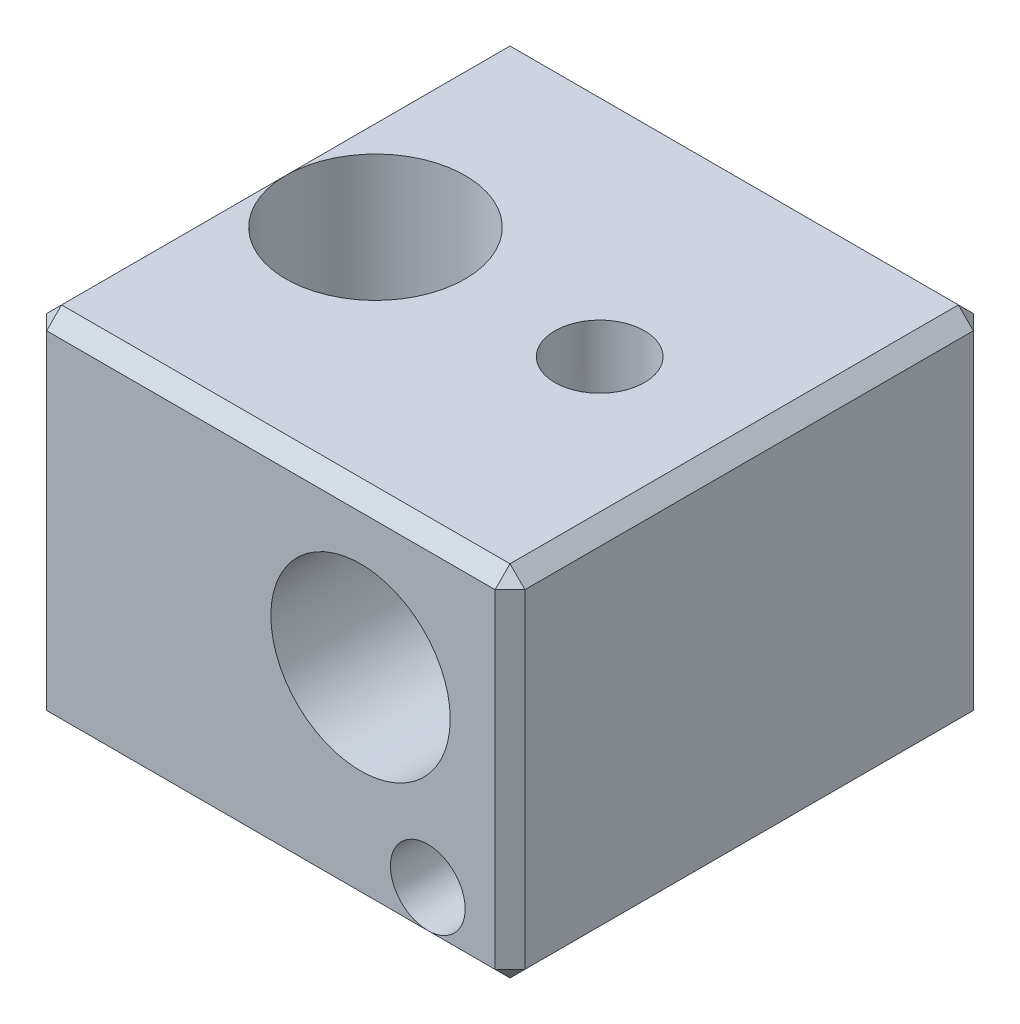
ISO-10303-21;
HEADER;
FILE_DESCRIPTION(('STEP AP214'),'2;1');
FILE_NAME('part.step','',(''),(''),'','','');
FILE_SCHEMA(('AUTOMOTIVE_DESIGN { 1 0 10303 214 1 1 1 1 }'));
ENDSEC;
DATA;
#1=APPLICATION_CONTEXT('core data for automotive mechanical design processes');
#2=APPLICATION_PROTOCOL_DEFINITION('international standard','automotive_design',2000,#1);
#3=PRODUCT_CONTEXT('',#1,'mechanical');
#4=PRODUCT('Part','Part','',(#3));
#5=PRODUCT_RELATED_PRODUCT_CATEGORY('part','',(#4));
#6=PRODUCT_DEFINITION_FORMATION('','',#4);
#7=PRODUCT_DEFINITION_CONTEXT('part definition',#1,'design');
#8=PRODUCT_DEFINITION('design','',#6,#7);
#9=PRODUCT_DEFINITION_SHAPE('','',#8);
#10=(LENGTH_UNIT() NAMED_UNIT(*) SI_UNIT(.MILLI.,.METRE.));
#11=(NAMED_UNIT(*) PLANE_ANGLE_UNIT() SI_UNIT($,.RADIAN.));
#12=(NAMED_UNIT(*) SI_UNIT($,.STERADIAN.) SOLID_ANGLE_UNIT());
#13=UNCERTAINTY_MEASURE_WITH_UNIT(LENGTH_MEASURE(1.E-05),#10,'distance_accuracy_value','');
#14=(GEOMETRIC_REPRESENTATION_CONTEXT(3) GLOBAL_UNCERTAINTY_ASSIGNED_CONTEXT((#13)) GLOBAL_UNIT_ASSIGNED_CONTEXT((#10,
#11,#12)) REPRESENTATION_CONTEXT('',''));
#15=CARTESIAN_POINT('',(0.,0.,0.));
#16=DIRECTION('',(0.,0.,1.));
#17=DIRECTION('',(1.,0.,0.));
#18=AXIS2_PLACEMENT_3D('',#15,#16,#17);
#19=CARTESIAN_POINT('',(-8.,12.,-8.));
#20=DIRECTION('',(1.,0.,0.));
#21=DIRECTION('',(0.,0.,-1.));
#22=AXIS2_PLACEMENT_3D('',#19,#20,#21);
#23=PLANE('',#22);
#24=DIRECTION('',(0.,-1.,0.));
#25=VECTOR('',#24,1.);
#26=CARTESIAN_POINT('',(-8.,12.,-7.5));
#27=LINE('',#26,#25);
#28=CARTESIAN_POINT('',(-8.,11.5,-7.5));
#29=VERTEX_POINT('',#28);
#30=CARTESIAN_POINT('',(-8.,0.5,-7.5));
#31=VERTEX_POINT('',#30);
#32=EDGE_CURVE('E144',#29,#31,#27,.T.);
#33=ORIENTED_EDGE('',*,*,#32,.T.);
#34=DIRECTION('',(0.,0.,1.));
#35=VECTOR('',#34,1.);
#36=CARTESIAN_POINT('',(-8.,0.5,-8.));
#37=LINE('',#36,#35);
#38=CARTESIAN_POINT('',(-8.,0.5,7.5));
#39=VERTEX_POINT('',#38);
#40=EDGE_CURVE('E140',#31,#39,#37,.T.);
#41=ORIENTED_EDGE('',*,*,#40,.T.);
#42=DIRECTION('',(0.,1.,0.));
#43=VECTOR('',#42,1.);
#44=CARTESIAN_POINT('',(-8.,12.,7.5));
#45=LINE('',#44,#43);
#46=CARTESIAN_POINT('',(-8.,11.5,7.5));
#47=VERTEX_POINT('',#46);
#48=EDGE_CURVE('E135',#39,#47,#45,.T.);
#49=ORIENTED_EDGE('',*,*,#48,.T.);
#50=DIRECTION('',(0.,0.,-1.));
#51=VECTOR('',#50,1.);
#52=CARTESIAN_POINT('',(-8.,11.5,-8.));
#53=LINE('',#52,#51);
#54=EDGE_CURVE('E137',#47,#29,#53,.T.);
#55=ORIENTED_EDGE('',*,*,#54,.T.);
#56=EDGE_LOOP('',(#33,#41,#49,#55));
#57=FACE_BOUND('',#56,.T.);
#58=ADVANCED_FACE('F34',(#57),#23,.F.);
#59=CARTESIAN_POINT('',(-8.,12.,8.));
#60=DIRECTION('',(0.,0.,-1.));
#61=DIRECTION('',(-1.,0.,0.));
#62=AXIS2_PLACEMENT_3D('',#59,#60,#61);
#63=PLANE('',#62);
#64=CARTESIAN_POINT('',(3.,7.,8.));
#65=DIRECTION('',(0.,0.,1.));
#66=DIRECTION('',(1.,0.,0.));
#67=AXIS2_PLACEMENT_3D('',#64,#65,#66);
#68=CIRCLE('',#67,3.);
#69=CARTESIAN_POINT('',(6.,7.,8.));
#70=VERTEX_POINT('',#69);
#71=EDGE_CURVE('E214',#70,#70,#68,.T.);
#72=ORIENTED_EDGE('',*,*,#71,.F.);
#73=EDGE_LOOP('',(#72));
#74=FACE_BOUND('',#73,.T.);
#75=DIRECTION('',(0.,-1.,0.));
#76=VECTOR('',#75,1.);
#77=CARTESIAN_POINT('',(-7.49999999999999,12.,8.));
#78=LINE('',#77,#76);
#79=CARTESIAN_POINT('',(-7.49999999999999,11.5,8.));
#80=VERTEX_POINT('',#79);
#81=CARTESIAN_POINT('',(-7.49999999999999,0.500000000000004,8.));
#82=VERTEX_POINT('',#81);
#83=EDGE_CURVE('E167',#80,#82,#78,.T.);
#84=ORIENTED_EDGE('',*,*,#83,.T.);
#85=DIRECTION('',(1.,0.,0.));
#86=VECTOR('',#85,1.);
#87=CARTESIAN_POINT('',(-8.,0.500000000000004,8.));
#88=LINE('',#87,#86);
#89=CARTESIAN_POINT('',(5.25,0.500000000000004,8.));
#90=VERTEX_POINT('',#89);
#91=EDGE_CURVE('E269',#82,#90,#88,.T.);
#92=ORIENTED_EDGE('',*,*,#91,.T.);
#93=CARTESIAN_POINT('',(5.25,1.75,8.));
#94=DIRECTION('',(0.,0.,1.));
#95=DIRECTION('',(1.,0.,0.));
#96=AXIS2_PLACEMENT_3D('',#93,#94,#95);
#97=CIRCLE('',#96,1.25);
#98=EDGE_CURVE('E224',#90,#90,#97,.T.);
#99=ORIENTED_EDGE('',*,*,#98,.F.);
#100=DIRECTION('',(1.,0.,0.));
#101=VECTOR('',#100,1.);
#102=CARTESIAN_POINT('',(-8.,0.500000000000004,8.));
#103=LINE('',#102,#101);
#104=CARTESIAN_POINT('',(7.5,0.500000000000004,8.));
#105=VERTEX_POINT('',#104);
#106=EDGE_CURVE('E267',#90,#105,#103,.T.);
#107=ORIENTED_EDGE('',*,*,#106,.T.);
#108=DIRECTION('',(0.,1.,0.));
#109=VECTOR('',#108,1.);
#110=CARTESIAN_POINT('',(7.5,12.,8.));
#111=LINE('',#110,#109);
#112=CARTESIAN_POINT('',(7.5,11.5,8.));
#113=VERTEX_POINT('',#112);
#114=EDGE_CURVE('E265',#105,#113,#111,.T.);
#115=ORIENTED_EDGE('',*,*,#114,.T.);
#116=DIRECTION('',(-1.,0.,0.));
#117=VECTOR('',#116,1.);
#118=CARTESIAN_POINT('',(-8.,11.5,8.));
#119=LINE('',#118,#117);
#120=EDGE_CURVE('E262',#113,#80,#119,.T.);
#121=ORIENTED_EDGE('',*,*,#120,.T.);
#122=EDGE_LOOP('',(#84,#92,#99,#107,#115,#121));
#123=FACE_BOUND('',#122,.T.);
#124=ADVANCED_FACE('F323',(#74,#123),#63,.F.);
#125=CARTESIAN_POINT('',(8.,12.,-8.));
#126=DIRECTION('',(-1.,0.,0.));
#127=DIRECTION('',(0.,0.,1.));
#128=AXIS2_PLACEMENT_3D('',#125,#126,#127);
#129=PLANE('',#128);
#130=DIRECTION('',(0.,-1.,0.));
#131=VECTOR('',#130,1.);
#132=CARTESIAN_POINT('',(8.,12.,7.5));
#133=LINE('',#132,#131);
#134=CARTESIAN_POINT('',(8.,11.5,7.5));
#135=VERTEX_POINT('',#134);
#136=CARTESIAN_POINT('',(8.,0.5,7.5));
#137=VERTEX_POINT('',#136);
#138=EDGE_CURVE('E274',#135,#137,#133,.T.);
#139=ORIENTED_EDGE('',*,*,#138,.T.);
#140=DIRECTION('',(0.,0.,-1.));
#141=VECTOR('',#140,1.);
#142=CARTESIAN_POINT('',(8.,0.5,-8.));
#143=LINE('',#142,#141);
#144=CARTESIAN_POINT('',(8.,0.5,-7.5));
#145=VERTEX_POINT('',#144);
#146=EDGE_CURVE('E278',#137,#145,#143,.T.);
#147=ORIENTED_EDGE('',*,*,#146,.T.);
#148=DIRECTION('',(0.,1.,0.));
#149=VECTOR('',#148,1.);
#150=CARTESIAN_POINT('',(8.,12.,-7.5));
#151=LINE('',#150,#149);
#152=CARTESIAN_POINT('',(8.,11.5,-7.5));
#153=VERTEX_POINT('',#152);
#154=EDGE_CURVE('E276',#145,#153,#151,.T.);
#155=ORIENTED_EDGE('',*,*,#154,.T.);
#156=DIRECTION('',(0.,0.,1.));
#157=VECTOR('',#156,1.);
#158=CARTESIAN_POINT('',(8.,11.5,8.));
#159=LINE('',#158,#157);
#160=EDGE_CURVE('E272',#153,#135,#159,.T.);
#161=ORIENTED_EDGE('',*,*,#160,.T.);
#162=EDGE_LOOP('',(#139,#147,#155,#161));
#163=FACE_BOUND('',#162,.T.);
#164=ADVANCED_FACE('F346',(#163),#129,.F.);
#165=CARTESIAN_POINT('',(-8.,12.,-8.));
#166=DIRECTION('',(0.,0.,1.));
#167=DIRECTION('',(1.,0.,0.));
#168=AXIS2_PLACEMENT_3D('',#165,#166,#167);
#169=PLANE('',#168);
#170=CARTESIAN_POINT('',(3.,7.,-8.));
#171=DIRECTION('',(0.,0.,1.));
#172=DIRECTION('',(1.,0.,0.));
#173=AXIS2_PLACEMENT_3D('',#170,#171,#172);
#174=CIRCLE('',#173,3.);
#175=CARTESIAN_POINT('',(6.,7.,-8.));
#176=VERTEX_POINT('',#175);
#177=EDGE_CURVE('E219',#176,#176,#174,.T.);
#178=ORIENTED_EDGE('',*,*,#177,.T.);
#179=EDGE_LOOP('',(#178));
#180=FACE_BOUND('',#179,.T.);
#181=DIRECTION('',(0.,-1.,0.));
#182=VECTOR('',#181,1.);
#183=CARTESIAN_POINT('',(7.5,12.,-8.));
#184=LINE('',#183,#182);
#185=CARTESIAN_POINT('',(7.5,11.5,-8.));
#186=VERTEX_POINT('',#185);
#187=CARTESIAN_POINT('',(7.5,0.5,-8.));
#188=VERTEX_POINT('',#187);
#189=EDGE_CURVE('E255',#186,#188,#184,.T.);
#190=ORIENTED_EDGE('',*,*,#189,.T.);
#191=DIRECTION('',(-1.,0.,0.));
#192=VECTOR('',#191,1.);
#193=CARTESIAN_POINT('',(-8.,0.5,-8.));
#194=LINE('',#193,#192);
#195=CARTESIAN_POINT('',(5.25,0.5,-8.));
#196=VERTEX_POINT('',#195);
#197=EDGE_CURVE('E259',#188,#196,#194,.T.);
#198=ORIENTED_EDGE('',*,*,#197,.T.);
#199=CARTESIAN_POINT('',(5.25,1.75,-8.));
#200=DIRECTION('',(0.,0.,1.));
#201=DIRECTION('',(1.,0.,0.));
#202=AXIS2_PLACEMENT_3D('',#199,#200,#201);
#203=CIRCLE('',#202,1.25);
#204=EDGE_CURVE('E228',#196,#196,#203,.T.);
#205=ORIENTED_EDGE('',*,*,#204,.T.);
#206=DIRECTION('',(-1.,0.,0.));
#207=VECTOR('',#206,1.);
#208=CARTESIAN_POINT('',(-8.,0.5,-8.));
#209=LINE('',#208,#207);
#210=CARTESIAN_POINT('',(-7.5,0.5,-8.));
#211=VERTEX_POINT('',#210);
#212=EDGE_CURVE('E257',#196,#211,#209,.T.);
#213=ORIENTED_EDGE('',*,*,#212,.T.);
#214=DIRECTION('',(0.,1.,0.));
#215=VECTOR('',#214,1.);
#216=CARTESIAN_POINT('',(-7.5,12.,-8.));
#217=LINE('',#216,#215);
#218=CARTESIAN_POINT('',(-7.5,11.5,-8.));
#219=VERTEX_POINT('',#218);
#220=EDGE_CURVE('E253',#211,#219,#217,.T.);
#221=ORIENTED_EDGE('',*,*,#220,.T.);
#222=DIRECTION('',(1.,0.,0.));
#223=VECTOR('',#222,1.);
#224=CARTESIAN_POINT('',(8.,11.5,-8.));
#225=LINE('',#224,#223);
#226=EDGE_CURVE('E251',#219,#186,#225,.T.);
#227=ORIENTED_EDGE('',*,*,#226,.T.);
#228=EDGE_LOOP('',(#190,#198,#205,#213,#221,#227));
#229=FACE_BOUND('',#228,.T.);
#230=ADVANCED_FACE('F433',(#180,#229),#169,.F.);
#231=CARTESIAN_POINT('',(0.,12.,0.));
#232=DIRECTION('',(0.,1.,0.));
#233=DIRECTION('',(0.,0.,1.));
#234=AXIS2_PLACEMENT_3D('',#231,#232,#233);
#235=PLANE('',#234);
#236=CARTESIAN_POINT('',(3.,12.,0.));
#237=DIRECTION('',(0.,1.,0.));
#238=DIRECTION('',(0.,0.,1.));
#239=AXIS2_PLACEMENT_3D('',#236,#237,#238);
#240=CIRCLE('',#239,1.5);
#241=CARTESIAN_POINT('',(3.,12.,1.5));
#242=VERTEX_POINT('',#241);
#243=EDGE_CURVE('E291',#242,#242,#240,.T.);
#244=ORIENTED_EDGE('',*,*,#243,.F.);
#245=EDGE_LOOP('',(#244));
#246=FACE_BOUND('',#245,.T.);
#247=DIRECTION('',(1.,0.,0.));
#248=VECTOR('',#247,1.);
#249=CARTESIAN_POINT('',(8.,12.,7.5));
#250=LINE('',#249,#248);
#251=CARTESIAN_POINT('',(-7.5,12.,7.5));
#252=VERTEX_POINT('',#251);
#253=CARTESIAN_POINT('',(7.5,12.,7.5));
#254=VERTEX_POINT('',#253);
#255=EDGE_CURVE('E281',#252,#254,#250,.T.);
#256=ORIENTED_EDGE('',*,*,#255,.T.);
#257=DIRECTION('',(0.,0.,-1.));
#258=VECTOR('',#257,1.);
#259=CARTESIAN_POINT('',(7.5,12.,-8.));
#260=LINE('',#259,#258);
#261=CARTESIAN_POINT('',(7.5,12.,-7.5));
#262=VERTEX_POINT('',#261);
#263=EDGE_CURVE('E11',#254,#262,#260,.T.);
#264=ORIENTED_EDGE('',*,*,#263,.T.);
#265=DIRECTION('',(-1.,0.,0.));
#266=VECTOR('',#265,1.);
#267=CARTESIAN_POINT('',(-8.,12.,-7.5));
#268=LINE('',#267,#266);
#269=CARTESIAN_POINT('',(-7.5,12.,-7.5));
#270=VERTEX_POINT('',#269);
#271=EDGE_CURVE('E43',#262,#270,#268,.T.);
#272=ORIENTED_EDGE('',*,*,#271,.T.);
#273=DIRECTION('',(0.,0.,1.));
#274=VECTOR('',#273,1.);
#275=CARTESIAN_POINT('',(-7.5,12.,8.));
#276=LINE('',#275,#274);
#277=CARTESIAN_POINT('',(-7.5,12.,0.));
#278=VERTEX_POINT('',#277);
#279=EDGE_CURVE('E285',#270,#278,#276,.T.);
#280=ORIENTED_EDGE('',*,*,#279,.T.);
#281=CARTESIAN_POINT('',(-4.5,12.,0.));
#282=DIRECTION('',(0.,1.,0.));
#283=DIRECTION('',(0.,0.,1.));
#284=AXIS2_PLACEMENT_3D('',#281,#282,#283);
#285=CIRCLE('',#284,3.);
#286=EDGE_CURVE('E231',#278,#278,#285,.T.);
#287=ORIENTED_EDGE('',*,*,#286,.F.);
#288=DIRECTION('',(0.,0.,1.));
#289=VECTOR('',#288,1.);
#290=CARTESIAN_POINT('',(-7.5,12.,8.));
#291=LINE('',#290,#289);
#292=EDGE_CURVE('E283',#278,#252,#291,.T.);
#293=ORIENTED_EDGE('',*,*,#292,.T.);
#294=EDGE_LOOP('',(#256,#264,#272,#280,#287,#293));
#295=FACE_BOUND('',#294,.T.);
#296=ADVANCED_FACE('F416',(#246,#295),#235,.T.);
#297=CARTESIAN_POINT('',(0.,0.,0.));
#298=DIRECTION('',(0.,1.,0.));
#299=DIRECTION('',(0.,0.,1.));
#300=AXIS2_PLACEMENT_3D('',#297,#298,#299);
#301=PLANE('',#300);
#302=DIRECTION('',(-1.,0.,0.));
#303=VECTOR('',#302,1.);
#304=CARTESIAN_POINT('',(0.,0.,7.5));
#305=LINE('',#304,#303);
#306=CARTESIAN_POINT('',(7.5,0.,7.5));
#307=VERTEX_POINT('',#306);
#308=CARTESIAN_POINT('',(-7.49999999999999,0.,7.5));
#309=VERTEX_POINT('',#308);
#310=EDGE_CURVE('E242',#307,#309,#305,.T.);
#311=ORIENTED_EDGE('',*,*,#310,.T.);
#312=DIRECTION('',(0.,0.,-1.));
#313=VECTOR('',#312,1.);
#314=CARTESIAN_POINT('',(-7.49999999999999,0.,0.));
#315=LINE('',#314,#313);
#316=CARTESIAN_POINT('',(-7.49999999999999,0.,0.));
#317=VERTEX_POINT('',#316);
#318=EDGE_CURVE('E248',#309,#317,#315,.T.);
#319=ORIENTED_EDGE('',*,*,#318,.T.);
#320=CARTESIAN_POINT('',(-4.5,0.,0.));
#321=DIRECTION('',(0.,1.,0.));
#322=DIRECTION('',(0.,0.,1.));
#323=AXIS2_PLACEMENT_3D('',#320,#321,#322);
#324=CIRCLE('',#323,3.);
#325=EDGE_CURVE('E156',#317,#317,#324,.T.);
#326=ORIENTED_EDGE('',*,*,#325,.T.);
#327=DIRECTION('',(0.,0.,-1.));
#328=VECTOR('',#327,1.);
#329=CARTESIAN_POINT('',(-7.49999999999999,0.,0.));
#330=LINE('',#329,#328);
#331=CARTESIAN_POINT('',(-7.5,0.,-7.5));
#332=VERTEX_POINT('',#331);
#333=EDGE_CURVE('E246',#317,#332,#330,.T.);
#334=ORIENTED_EDGE('',*,*,#333,.T.);
#335=DIRECTION('',(1.,0.,0.));
#336=VECTOR('',#335,1.);
#337=CARTESIAN_POINT('',(0.,0.,-7.5));
#338=LINE('',#337,#336);
#339=CARTESIAN_POINT('',(7.5,0.,-7.5));
#340=VERTEX_POINT('',#339);
#341=EDGE_CURVE('E244',#332,#340,#338,.T.);
#342=ORIENTED_EDGE('',*,*,#341,.T.);
#343=DIRECTION('',(0.,0.,1.));
#344=VECTOR('',#343,1.);
#345=CARTESIAN_POINT('',(7.5,0.,0.));
#346=LINE('',#345,#344);
#347=EDGE_CURVE('E240',#340,#307,#346,.T.);
#348=ORIENTED_EDGE('',*,*,#347,.T.);
#349=EDGE_LOOP('',(#311,#319,#326,#334,#342,#348));
#350=FACE_BOUND('',#349,.T.);
#351=ADVANCED_FACE('F337',(#350),#301,.F.);
#352=CARTESIAN_POINT('',(-4.5,0.,0.));
#353=DIRECTION('',(0.,1.,0.));
#354=DIRECTION('',(0.,0.,1.));
#355=AXIS2_PLACEMENT_3D('',#352,#353,#354);
#356=CYLINDRICAL_SURFACE('',#355,3.);
#357=ORIENTED_EDGE('',*,*,#325,.F.);
#358=EDGE_LOOP('',(#357));
#359=FACE_BOUND('',#358,.T.);
#360=ORIENTED_EDGE('',*,*,#286,.T.);
#361=EDGE_LOOP('',(#360));
#362=FACE_BOUND('',#361,.T.);
#363=ADVANCED_FACE('F328',(#359,#362),#356,.F.);
#364=CARTESIAN_POINT('',(5.25,1.75,-8.));
#365=DIRECTION('',(0.,0.,1.));
#366=DIRECTION('',(1.,0.,0.));
#367=AXIS2_PLACEMENT_3D('',#364,#365,#366);
#368=CYLINDRICAL_SURFACE('',#367,1.25);
#369=ORIENTED_EDGE('',*,*,#204,.F.);
#370=EDGE_LOOP('',(#369));
#371=FACE_BOUND('',#370,.T.);
#372=ORIENTED_EDGE('',*,*,#98,.T.);
#373=EDGE_LOOP('',(#372));
#374=FACE_BOUND('',#373,.T.);
#375=ADVANCED_FACE('F325',(#371,#374),#368,.F.);
#376=CARTESIAN_POINT('',(3.,7.,-8.));
#377=DIRECTION('',(0.,0.,1.));
#378=DIRECTION('',(1.,0.,0.));
#379=AXIS2_PLACEMENT_3D('',#376,#377,#378);
#380=CYLINDRICAL_SURFACE('',#379,3.);
#381=CARTESIAN_POINT('',(3.,10.,1.5));
#382=CARTESIAN_POINT('',(2.92114205557315,9.99999570107562,1.49999504652421));
#383=CARTESIAN_POINT('',(2.84219010045366,9.99685736529635,1.49374489031842));
#384=CARTESIAN_POINT('',(2.68661964709666,9.98461234055736,1.46902067948769));
#385=CARTESIAN_POINT('',(2.61000586992956,9.97549431743379,1.45052341050328));
#386=CARTESIAN_POINT('',(2.46159968267933,9.95224419105063,1.40220928707506));
#387=CARTESIAN_POINT('',(2.38978979559128,9.93813158766306,1.37243642362805));
#388=CARTESIAN_POINT('',(2.25229107479011,9.90618664773642,1.30264406795252));
#389=CARTESIAN_POINT('',(2.18660175901491,9.88835460450288,1.2626253836267));
#390=CARTESIAN_POINT('',(2.05873827335714,9.84934387387093,1.17072412577207));
#391=CARTESIAN_POINT('',(1.99701718331684,9.82802798691306,1.11827028114054));
#392=CARTESIAN_POINT('',(1.88283083269953,9.78489955370114,1.00421778112945));
#393=CARTESIAN_POINT('',(1.83037262533985,9.76308664313552,0.942612222341338));
#394=CARTESIAN_POINT('',(1.73212199932459,9.71948426796021,0.806274975714928));
#395=CARTESIAN_POINT('',(1.68716199667255,9.69782780455198,0.730895852481132));
#396=CARTESIAN_POINT('',(1.61074765966396,9.65928968158481,0.572448996020678));
#397=CARTESIAN_POINT('',(1.5792836775505,9.64240461410485,0.489386806915876));
#398=CARTESIAN_POINT('',(1.53280133671712,9.61686800556713,0.323002341867116));
#399=CARTESIAN_POINT('',(1.51691121437934,9.6077840737557,0.239993321898909));
#400=CARTESIAN_POINT('',(1.49935951003673,9.59772834922792,0.0720317433307847));
#401=CARTESIAN_POINT('',(1.49768386744039,9.59674854014932,-0.0129188113067322));
#402=CARTESIAN_POINT('',(1.50796906924156,9.60266395385873,-0.171429036473053));
#403=CARTESIAN_POINT('',(1.51832316069477,9.6086314549302,-0.245136046834576));
#404=CARTESIAN_POINT('',(1.5495902264146,9.62614343100775,-0.389582864059563));
#405=CARTESIAN_POINT('',(1.57050656415353,9.63768968247664,-0.460321717957974));
#406=CARTESIAN_POINT('',(1.622685329421,9.66531214619111,-0.598843698848489));
#407=CARTESIAN_POINT('',(1.65417739932601,9.68148760995998,-0.666519598178684));
#408=CARTESIAN_POINT('',(1.726437468498,9.71655106422105,-0.795951438885012));
#409=CARTESIAN_POINT('',(1.7672096342813,9.73544027170286,-0.857704703400134));
#410=CARTESIAN_POINT('',(1.86290091763082,9.77669736854929,-0.981781879114839));
#411=CARTESIAN_POINT('',(1.91895831244608,9.79920265355119,-1.04318531036424));
#412=CARTESIAN_POINT('',(2.04066663188794,9.84321434950611,-1.15610312788635));
#413=CARTESIAN_POINT('',(2.10632211513858,9.86472027938201,-1.20761278805082));
#414=CARTESIAN_POINT('',(2.24922524125223,9.90552980924446,-1.30152849154459));
#415=CARTESIAN_POINT('',(2.32686961260089,9.92468476243011,-1.34340070866861));
#416=CARTESIAN_POINT('',(2.48930067676681,9.95736821681863,-1.41314554356451));
#417=CARTESIAN_POINT('',(2.57408163560209,9.9709011841533,-1.44102927752275));
#418=CARTESIAN_POINT('',(2.74085026250895,9.98986500612153,-1.47971310557502));
#419=CARTESIAN_POINT('',(2.82248770417751,9.99587407451965,-1.49173685362017));
#420=CARTESIAN_POINT('',(2.98683060007598,10.0010952018866,-1.50219709670173));
#421=CARTESIAN_POINT('',(3.06953552980487,10.0003104808198,-1.5006400284592));
#422=CARTESIAN_POINT('',(3.22684945797898,9.99236788380152,-1.48468996737188));
#423=CARTESIAN_POINT('',(3.3015891120749,9.98570868532252,-1.47130120090501));
#424=CARTESIAN_POINT('',(3.44761033845292,9.9673325697226,-1.43364289215732));
#425=CARTESIAN_POINT('',(3.51889152853663,9.95561509501618,-1.40937215031976));
#426=CARTESIAN_POINT('',(3.65833291267436,9.92776377120382,-1.35000230035045));
#427=CARTESIAN_POINT('',(3.72634559550871,9.91151322654446,-1.31461342482557));
#428=CARTESIAN_POINT('',(3.85569204254891,9.87615961476127,-1.23433869653015));
#429=CARTESIAN_POINT('',(3.91702294466489,9.85705533350407,-1.18944879810691));
#430=CARTESIAN_POINT('',(4.03765153393383,9.81562332004297,-1.08635936200393));
#431=CARTESIAN_POINT('',(4.09615811672855,9.79316327265249,-1.02728569733228));
#432=CARTESIAN_POINT('',(4.20278448167829,9.7489358741323,-0.900112273083409));
#433=CARTESIAN_POINT('',(4.25089707856781,9.72716901100071,-0.832006321728121));
#434=CARTESIAN_POINT('',(4.33756187171853,9.68576788309734,-0.684534518740537));
#435=CARTESIAN_POINT('',(4.37553824370038,9.66628794383591,-0.604783100858278));
#436=CARTESIAN_POINT('',(4.43712423890206,9.63361108441202,-0.438734898637551));
#437=CARTESIAN_POINT('',(4.46075237380053,9.62040607332625,-0.352446710299665));
#438=CARTESIAN_POINT('',(4.49079253120031,9.60342251538703,-0.184634665672944));
#439=CARTESIAN_POINT('',(4.49863949460818,9.59886075197597,-0.103448619847138));
#440=CARTESIAN_POINT('',(4.50103373156431,9.59748031962405,0.0591706007467873));
#441=CARTESIAN_POINT('',(4.49558676993487,9.60065829439585,0.140603653106792));
#442=CARTESIAN_POINT('',(4.47288918838997,9.61356793076615,0.293225252300156));
#443=CARTESIAN_POINT('',(4.45681247151455,9.62264641723988,0.36465070521711));
#444=CARTESIAN_POINT('',(4.41476303733662,9.64556524281479,0.50371217913655));
#445=CARTESIAN_POINT('',(4.38878713673989,9.65940711354503,0.571346973138048));
#446=CARTESIAN_POINT('',(4.32572361795085,9.69142795546803,0.705937276479806));
#447=CARTESIAN_POINT('',(4.28800670672356,9.70983583593881,0.772541852743542));
#448=CARTESIAN_POINT('',(4.20322645745609,9.74852997452291,0.898911804271888));
#449=CARTESIAN_POINT('',(4.15615825686235,9.76881720693416,0.958673595781668));
#450=CARTESIAN_POINT('',(4.04730498999206,9.81193484737138,1.07721297353201));
#451=CARTESIAN_POINT('',(3.98442663449589,9.83477474959942,1.13498865352544));
#452=CARTESIAN_POINT('',(3.8492322093498,9.87816628389896,1.2393944751529));
#453=CARTESIAN_POINT('',(3.7769110849578,9.89871667939293,1.28601860920486));
#454=CARTESIAN_POINT('',(3.62389739517442,9.93547014349806,1.36685454406811));
#455=CARTESIAN_POINT('',(3.5431492556651,9.95164144740899,1.4009762538547));
#456=CARTESIAN_POINT('',(3.37611315170713,9.9775201194848,1.45471225163611));
#457=CARTESIAN_POINT('',(3.28984169938365,9.98724585044602,1.47436777020857));
#458=CARTESIAN_POINT('',(3.16890291973635,9.99543192870217,1.49084611662861));
#459=CARTESIAN_POINT('',(3.13524281916235,9.99714048010376,1.49427396129951));
#460=CARTESIAN_POINT('',(3.06772759770764,9.99942545465223,1.49885199827113));
#461=CARTESIAN_POINT('',(3.03387247146995,10.0000018465507,1.50000212770531));
#462=CARTESIAN_POINT('',(3.,10.,1.5));
#463=B_SPLINE_CURVE_WITH_KNOTS('',3,(#381,#382,#383,#384,#385,#386,#387,#388,#389,#390,#391,
#392,#393,#394,#395,#396,#397,#398,#399,#400,#401,#402,#403,#404,#405,#406,#407,#408,#409,#410,
#411,#412,#413,#414,#415,#416,#417,#418,#419,#420,#421,#422,#423,#424,#425,#426,#427,#428,#429,
#430,#431,#432,#433,#434,#435,#436,#437,#438,#439,#440,#441,#442,#443,#444,#445,#446,#447,#448,
#449,#450,#451,#452,#453,#454,#455,#456,#457,#458,#459,#460,#461,#462),.UNSPECIFIED.,.T.,.F.,(4,
2,2,2,2,2,2,2,2,2,2,2,2,2,2,2,2,2,2,2,2,2,2,2,2,2,2,2,2,2,2,2,2,2,2,2,2,2,2,2,4),(0.,
0.236436386130439,0.473322224563797,0.709293233238448,0.945245640872352,1.19547263807713,
1.44588935648105,1.71572589646129,1.98536921847421,2.23887018210344,2.49212035993531,
2.71508568613981,2.93812205888518,3.16635360252731,3.39468781890333,3.65197412000818,
3.9093830189803,4.17874533321661,4.44789325368419,4.69474935707019,4.94148846767214,
5.16910359759183,5.39674382446397,5.63089284041848,5.86514176122509,6.12239415966628,
6.37982382923148,6.64972023242589,6.91926767918176,7.1629396125457,7.40650589797018,
7.62686895373284,7.84730293182527,8.08254685170431,8.31791341715446,8.58187864135758,
8.84598575071869,9.1119602049529,9.37717362931724,9.47872920200876,9.580287577666),.UNSPECIFIED.);
#464=CARTESIAN_POINT('',(3.,10.,1.5));
#465=VERTEX_POINT('',#464);
#466=EDGE_CURVE('E620',#465,#465,#463,.T.);
#467=ORIENTED_EDGE('',*,*,#466,.F.);
#468=EDGE_LOOP('',(#467));
#469=FACE_BOUND('',#468,.T.);
#470=ORIENTED_EDGE('',*,*,#177,.F.);
#471=EDGE_LOOP('',(#470));
#472=FACE_BOUND('',#471,.T.);
#473=ORIENTED_EDGE('',*,*,#71,.T.);
#474=EDGE_LOOP('',(#473));
#475=FACE_BOUND('',#474,.T.);
#476=ADVANCED_FACE('F327',(#469,#472,#475),#380,.F.);
#477=CARTESIAN_POINT('',(7.5,12.,0.));
#478=DIRECTION('',(0.70710678118655,0.707106781186545,0.));
#479=DIRECTION('',(0.,0.,1.));
#480=AXIS2_PLACEMENT_3D('',#477,#478,#479);
#481=PLANE('',#480);
#482=DIRECTION('',(0.707106781186545,-0.70710678118655,0.));
#483=VECTOR('',#482,1.);
#484=CARTESIAN_POINT('',(8.,11.5,-7.5));
#485=LINE('',#484,#483);
#486=EDGE_CURVE('E38',#262,#153,#485,.T.);
#487=ORIENTED_EDGE('',*,*,#486,.F.);
#488=ORIENTED_EDGE('',*,*,#263,.F.);
#489=DIRECTION('',(-0.707106781186545,0.70710678118655,0.));
#490=VECTOR('',#489,1.);
#491=CARTESIAN_POINT('',(7.75,11.75,7.5));
#492=LINE('',#491,#490);
#493=EDGE_CURVE('E207',#135,#254,#492,.T.);
#494=ORIENTED_EDGE('',*,*,#493,.F.);
#495=ORIENTED_EDGE('',*,*,#160,.F.);
#496=EDGE_LOOP('',(#487,#488,#494,#495));
#497=FACE_BOUND('',#496,.T.);
#498=ADVANCED_FACE('F36',(#497),#481,.T.);
#499=CARTESIAN_POINT('',(8.,11.5,-7.5));
#500=DIRECTION('',(0.57735026918963,0.577350269189622,-0.577350269189626));
#501=DIRECTION('',(-0.707106781186545,0.,-0.70710678118655));
#502=AXIS2_PLACEMENT_3D('',#499,#500,#501);
#503=PLANE('',#502);
#504=DIRECTION('',(0.,0.70710678118655,0.707106781186545));
#505=VECTOR('',#504,1.);
#506=CARTESIAN_POINT('',(7.5,11.75,-7.75));
#507=LINE('',#506,#505);
#508=EDGE_CURVE('E203',#262,#186,#507,.F.);
#509=ORIENTED_EDGE('',*,*,#508,.F.);
#510=ORIENTED_EDGE('',*,*,#486,.T.);
#511=DIRECTION('',(0.707106781186545,0.,0.70710678118655));
#512=VECTOR('',#511,1.);
#513=CARTESIAN_POINT('',(8.,11.5,-7.5));
#514=LINE('',#513,#512);
#515=EDGE_CURVE('E205',#186,#153,#514,.T.);
#516=ORIENTED_EDGE('',*,*,#515,.F.);
#517=EDGE_LOOP('',(#509,#510,#516));
#518=FACE_BOUND('',#517,.T.);
#519=ADVANCED_FACE('F406',(#518),#503,.T.);
#520=CARTESIAN_POINT('',(7.5,11.5,8.));
#521=DIRECTION('',(0.577350269189626,0.577350269189622,0.57735026918963));
#522=DIRECTION('',(0.70710678118655,0.,-0.707106781186545));
#523=AXIS2_PLACEMENT_3D('',#520,#521,#522);
#524=PLANE('',#523);
#525=DIRECTION('',(-0.70710678118655,0.,0.707106781186545));
#526=VECTOR('',#525,1.);
#527=CARTESIAN_POINT('',(7.5,11.5,8.));
#528=LINE('',#527,#526);
#529=EDGE_CURVE('E197',#135,#113,#528,.T.);
#530=ORIENTED_EDGE('',*,*,#529,.F.);
#531=ORIENTED_EDGE('',*,*,#493,.T.);
#532=DIRECTION('',(0.,-0.70710678118655,0.707106781186545));
#533=VECTOR('',#532,1.);
#534=CARTESIAN_POINT('',(7.5,11.5,8.));
#535=LINE('',#534,#533);
#536=EDGE_CURVE('E200',#113,#254,#535,.F.);
#537=ORIENTED_EDGE('',*,*,#536,.F.);
#538=EDGE_LOOP('',(#530,#531,#537));
#539=FACE_BOUND('',#538,.T.);
#540=ADVANCED_FACE('F403',(#539),#524,.T.);
#541=CARTESIAN_POINT('',(7.5,12.,-8.));
#542=DIRECTION('',(-0.70710678118655,0.,0.707106781186545));
#543=DIRECTION('',(0.,-1.,0.));
#544=AXIS2_PLACEMENT_3D('',#541,#542,#543);
#545=PLANE('',#544);
#546=ORIENTED_EDGE('',*,*,#515,.T.);
#547=ORIENTED_EDGE('',*,*,#154,.F.);
#548=DIRECTION('',(-0.707106781186545,0.,-0.70710678118655));
#549=VECTOR('',#548,1.);
#550=CARTESIAN_POINT('',(7.75,0.5,-7.75));
#551=LINE('',#550,#549);
#552=EDGE_CURVE('E192',#188,#145,#551,.F.);
#553=ORIENTED_EDGE('',*,*,#552,.F.);
#554=ORIENTED_EDGE('',*,*,#189,.F.);
#555=EDGE_LOOP('',(#546,#547,#553,#554));
#556=FACE_BOUND('',#555,.T.);
#557=ADVANCED_FACE('F400',(#556),#545,.F.);
#558=CARTESIAN_POINT('',(0.,12.,-7.5));
#559=DIRECTION('',(0.,0.707106781186545,-0.70710678118655));
#560=DIRECTION('',(1.,0.,0.));
#561=AXIS2_PLACEMENT_3D('',#558,#559,#560);
#562=PLANE('',#561);
#563=ORIENTED_EDGE('',*,*,#508,.T.);
#564=ORIENTED_EDGE('',*,*,#226,.F.);
#565=DIRECTION('',(0.,-0.70710678118655,-0.707106781186545));
#566=VECTOR('',#565,1.);
#567=CARTESIAN_POINT('',(-7.5,11.5,-8.));
#568=LINE('',#567,#566);
#569=EDGE_CURVE('E189',#270,#219,#568,.T.);
#570=ORIENTED_EDGE('',*,*,#569,.F.);
#571=ORIENTED_EDGE('',*,*,#271,.F.);
#572=EDGE_LOOP('',(#563,#564,#570,#571));
#573=FACE_BOUND('',#572,.T.);
#574=ADVANCED_FACE('F397',(#573),#562,.T.);
#575=CARTESIAN_POINT('',(-7.5,12.,0.));
#576=DIRECTION('',(-0.70710678118655,0.707106781186545,0.));
#577=DIRECTION('',(0.,0.,-1.));
#578=AXIS2_PLACEMENT_3D('',#575,#576,#577);
#579=PLANE('',#578);
#580=ORIENTED_EDGE('',*,*,#292,.F.);
#581=ORIENTED_EDGE('',*,*,#279,.F.);
#582=DIRECTION('',(0.707106781186545,0.70710678118655,0.));
#583=VECTOR('',#582,1.);
#584=CARTESIAN_POINT('',(-7.75,11.75,-7.5));
#585=LINE('',#584,#583);
#586=EDGE_CURVE('E154',#29,#270,#585,.T.);
#587=ORIENTED_EDGE('',*,*,#586,.F.);
#588=ORIENTED_EDGE('',*,*,#54,.F.);
#589=DIRECTION('',(-0.707106781186545,-0.70710678118655,0.));
#590=VECTOR('',#589,1.);
#591=CARTESIAN_POINT('',(-8.,11.5,7.5));
#592=LINE('',#591,#590);
#593=EDGE_CURVE('E151',#252,#47,#592,.T.);
#594=ORIENTED_EDGE('',*,*,#593,.F.);
#595=EDGE_LOOP('',(#580,#581,#587,#588,#594));
#596=FACE_BOUND('',#595,.T.);
#597=ADVANCED_FACE('F150',(#596),#579,.T.);
#598=CARTESIAN_POINT('',(0.,12.,7.5));
#599=DIRECTION('',(0.,0.707106781186545,0.70710678118655));
#600=DIRECTION('',(-1.,0.,0.));
#601=AXIS2_PLACEMENT_3D('',#598,#599,#600);
#602=PLANE('',#601);
#603=ORIENTED_EDGE('',*,*,#536,.T.);
#604=ORIENTED_EDGE('',*,*,#255,.F.);
#605=DIRECTION('',(0.,0.70710678118655,-0.707106781186545));
#606=VECTOR('',#605,1.);
#607=CARTESIAN_POINT('',(-7.49999999999999,11.75,7.75));
#608=LINE('',#607,#606);
#609=EDGE_CURVE('E164',#80,#252,#608,.T.);
#610=ORIENTED_EDGE('',*,*,#609,.F.);
#611=ORIENTED_EDGE('',*,*,#120,.F.);
#612=EDGE_LOOP('',(#603,#604,#610,#611));
#613=FACE_BOUND('',#612,.T.);
#614=ADVANCED_FACE('F390',(#613),#602,.T.);
#615=CARTESIAN_POINT('',(8.,12.,7.5));
#616=DIRECTION('',(-0.707106781186545,0.,-0.70710678118655));
#617=DIRECTION('',(0.,-1.,0.));
#618=AXIS2_PLACEMENT_3D('',#615,#616,#617);
#619=PLANE('',#618);
#620=ORIENTED_EDGE('',*,*,#529,.T.);
#621=ORIENTED_EDGE('',*,*,#114,.F.);
#622=DIRECTION('',(0.70710678118655,0.,-0.707106781186545));
#623=VECTOR('',#622,1.);
#624=CARTESIAN_POINT('',(7.5,0.500000000000004,8.));
#625=LINE('',#624,#623);
#626=EDGE_CURVE('E184',#137,#105,#625,.F.);
#627=ORIENTED_EDGE('',*,*,#626,.F.);
#628=ORIENTED_EDGE('',*,*,#138,.F.);
#629=EDGE_LOOP('',(#620,#621,#627,#628));
#630=FACE_BOUND('',#629,.T.);
#631=ADVANCED_FACE('F386',(#630),#619,.F.);
#632=CARTESIAN_POINT('',(8.,0.5,-8.));
#633=DIRECTION('',(-0.707106781186545,0.70710678118655,0.));
#634=DIRECTION('',(0.,0.,-1.));
#635=AXIS2_PLACEMENT_3D('',#632,#633,#634);
#636=PLANE('',#635);
#637=DIRECTION('',(0.70710678118655,0.707106781186545,0.));
#638=VECTOR('',#637,1.);
#639=CARTESIAN_POINT('',(7.5,0.,-7.5));
#640=LINE('',#639,#638);
#641=EDGE_CURVE('E194',#145,#340,#640,.F.);
#642=ORIENTED_EDGE('',*,*,#641,.F.);
#643=ORIENTED_EDGE('',*,*,#146,.F.);
#644=DIRECTION('',(-0.70710678118655,-0.707106781186545,0.));
#645=VECTOR('',#644,1.);
#646=CARTESIAN_POINT('',(7.75,0.25,7.5));
#647=LINE('',#646,#645);
#648=EDGE_CURVE('E181',#307,#137,#647,.F.);
#649=ORIENTED_EDGE('',*,*,#648,.F.);
#650=ORIENTED_EDGE('',*,*,#347,.F.);
#651=EDGE_LOOP('',(#642,#643,#649,#650));
#652=FACE_BOUND('',#651,.T.);
#653=ADVANCED_FACE('F382',(#652),#636,.F.);
#654=CARTESIAN_POINT('',(7.5,0.,-7.5));
#655=DIRECTION('',(0.577350269189626,-0.57735026918963,-0.577350269189622));
#656=DIRECTION('',(0.70710678118655,0.707106781186545,0.));
#657=AXIS2_PLACEMENT_3D('',#654,#655,#656);
#658=PLANE('',#657);
#659=ORIENTED_EDGE('',*,*,#552,.T.);
#660=ORIENTED_EDGE('',*,*,#641,.T.);
#661=DIRECTION('',(0.,-0.707106781186545,0.70710678118655));
#662=VECTOR('',#661,1.);
#663=CARTESIAN_POINT('',(7.5,0.,-7.5));
#664=LINE('',#663,#662);
#665=EDGE_CURVE('E172',#188,#340,#664,.T.);
#666=ORIENTED_EDGE('',*,*,#665,.F.);
#667=EDGE_LOOP('',(#659,#660,#666));
#668=FACE_BOUND('',#667,.T.);
#669=ADVANCED_FACE('F378',(#668),#658,.T.);
#670=CARTESIAN_POINT('',(-7.5,11.5,-8.));
#671=DIRECTION('',(-0.577350269189626,0.577350269189622,-0.57735026918963));
#672=DIRECTION('',(-0.70710678118655,0.,0.707106781186545));
#673=AXIS2_PLACEMENT_3D('',#670,#671,#672);
#674=PLANE('',#673);
#675=ORIENTED_EDGE('',*,*,#586,.T.);
#676=ORIENTED_EDGE('',*,*,#569,.T.);
#677=DIRECTION('',(0.70710678118655,0.,-0.707106781186545));
#678=VECTOR('',#677,1.);
#679=CARTESIAN_POINT('',(-7.5,11.5,-8.));
#680=LINE('',#679,#678);
#681=EDGE_CURVE('E168',#29,#219,#680,.T.);
#682=ORIENTED_EDGE('',*,*,#681,.F.);
#683=EDGE_LOOP('',(#675,#676,#682));
#684=FACE_BOUND('',#683,.T.);
#685=ADVANCED_FACE('F375',(#684),#674,.T.);
#686=CARTESIAN_POINT('',(-8.,11.5,7.5));
#687=DIRECTION('',(-0.577350269189626,0.577350269189622,0.57735026918963));
#688=DIRECTION('',(0.70710678118655,0.,0.707106781186545));
#689=AXIS2_PLACEMENT_3D('',#686,#687,#688);
#690=PLANE('',#689);
#691=ORIENTED_EDGE('',*,*,#609,.T.);
#692=ORIENTED_EDGE('',*,*,#593,.T.);
#693=DIRECTION('',(-0.70710678118655,0.,-0.707106781186545));
#694=VECTOR('',#693,1.);
#695=CARTESIAN_POINT('',(-8.,11.5,7.5));
#696=LINE('',#695,#694);
#697=EDGE_CURVE('E161',#80,#47,#696,.T.);
#698=ORIENTED_EDGE('',*,*,#697,.F.);
#699=EDGE_LOOP('',(#691,#692,#698));
#700=FACE_BOUND('',#699,.T.);
#701=ADVANCED_FACE('F160',(#700),#690,.T.);
#702=CARTESIAN_POINT('',(7.5,0.500000000000004,8.));
#703=DIRECTION('',(0.577350269189622,-0.577350269189626,0.57735026918963));
#704=DIRECTION('',(0.,-0.70710678118655,-0.707106781186545));
#705=AXIS2_PLACEMENT_3D('',#702,#703,#704);
#706=PLANE('',#705);
#707=ORIENTED_EDGE('',*,*,#648,.T.);
#708=ORIENTED_EDGE('',*,*,#626,.T.);
#709=DIRECTION('',(0.,0.70710678118655,0.707106781186545));
#710=VECTOR('',#709,1.);
#711=CARTESIAN_POINT('',(7.5,0.500000000000004,8.));
#712=LINE('',#711,#710);
#713=EDGE_CURVE('E169',#307,#105,#712,.T.);
#714=ORIENTED_EDGE('',*,*,#713,.F.);
#715=EDGE_LOOP('',(#707,#708,#714));
#716=FACE_BOUND('',#715,.T.);
#717=ADVANCED_FACE('F369',(#716),#706,.T.);
#718=CARTESIAN_POINT('',(-8.,0.5,-8.));
#719=DIRECTION('',(0.,0.70710678118655,0.707106781186545));
#720=DIRECTION('',(-1.,0.,0.));
#721=AXIS2_PLACEMENT_3D('',#718,#719,#720);
#722=PLANE('',#721);
#723=ORIENTED_EDGE('',*,*,#665,.T.);
#724=ORIENTED_EDGE('',*,*,#341,.F.);
#725=DIRECTION('',(0.,0.707106781186545,-0.70710678118655));
#726=VECTOR('',#725,1.);
#727=CARTESIAN_POINT('',(-7.5,0.,-7.5));
#728=LINE('',#727,#726);
#729=EDGE_CURVE('E175',#211,#332,#728,.F.);
#730=ORIENTED_EDGE('',*,*,#729,.F.);
#731=ORIENTED_EDGE('',*,*,#212,.F.);
#732=ORIENTED_EDGE('',*,*,#197,.F.);
#733=EDGE_LOOP('',(#723,#724,#730,#731,#732));
#734=FACE_BOUND('',#733,.T.);
#735=ADVANCED_FACE('F365',(#734),#722,.F.);
#736=CARTESIAN_POINT('',(-8.,12.,-7.5));
#737=DIRECTION('',(0.707106781186545,0.,0.70710678118655));
#738=DIRECTION('',(0.,-1.,0.));
#739=AXIS2_PLACEMENT_3D('',#736,#737,#738);
#740=PLANE('',#739);
#741=ORIENTED_EDGE('',*,*,#681,.T.);
#742=ORIENTED_EDGE('',*,*,#220,.F.);
#743=DIRECTION('',(-0.70710678118655,0.,0.707106781186545));
#744=VECTOR('',#743,1.);
#745=CARTESIAN_POINT('',(-7.75,0.5,-7.75));
#746=LINE('',#745,#744);
#747=EDGE_CURVE('E300',#31,#211,#746,.F.);
#748=ORIENTED_EDGE('',*,*,#747,.F.);
#749=ORIENTED_EDGE('',*,*,#32,.F.);
#750=EDGE_LOOP('',(#741,#742,#748,#749));
#751=FACE_BOUND('',#750,.T.);
#752=ADVANCED_FACE('F362',(#751),#740,.F.);
#753=CARTESIAN_POINT('',(-7.49999999999999,12.,8.));
#754=DIRECTION('',(0.707106781186545,0.,-0.70710678118655));
#755=DIRECTION('',(0.,-1.,0.));
#756=AXIS2_PLACEMENT_3D('',#753,#754,#755);
#757=PLANE('',#756);
#758=ORIENTED_EDGE('',*,*,#697,.T.);
#759=ORIENTED_EDGE('',*,*,#48,.F.);
#760=DIRECTION('',(0.70710678118655,0.,0.707106781186545));
#761=VECTOR('',#760,1.);
#762=CARTESIAN_POINT('',(-8.,0.5,7.5));
#763=LINE('',#762,#761);
#764=EDGE_CURVE('E297',#82,#39,#763,.F.);
#765=ORIENTED_EDGE('',*,*,#764,.F.);
#766=ORIENTED_EDGE('',*,*,#83,.F.);
#767=EDGE_LOOP('',(#758,#759,#765,#766));
#768=FACE_BOUND('',#767,.T.);
#769=ADVANCED_FACE('F166',(#768),#757,.F.);
#770=CARTESIAN_POINT('',(-8.,0.500000000000004,8.));
#771=DIRECTION('',(0.,0.707106781186545,-0.70710678118655));
#772=DIRECTION('',(1.,0.,0.));
#773=AXIS2_PLACEMENT_3D('',#770,#771,#772);
#774=PLANE('',#773);
#775=ORIENTED_EDGE('',*,*,#106,.F.);
#776=ORIENTED_EDGE('',*,*,#91,.F.);
#777=DIRECTION('',(0.,-0.70710678118655,-0.707106781186545));
#778=VECTOR('',#777,1.);
#779=CARTESIAN_POINT('',(-7.49999999999999,0.250000000000002,7.75));
#780=LINE('',#779,#778);
#781=EDGE_CURVE('E294',#309,#82,#780,.F.);
#782=ORIENTED_EDGE('',*,*,#781,.F.);
#783=ORIENTED_EDGE('',*,*,#310,.F.);
#784=ORIENTED_EDGE('',*,*,#713,.T.);
#785=EDGE_LOOP('',(#775,#776,#782,#783,#784));
#786=FACE_BOUND('',#785,.T.);
#787=ADVANCED_FACE('F320',(#786),#774,.F.);
#788=CARTESIAN_POINT('',(-7.5,0.,-7.5));
#789=DIRECTION('',(-0.577350269189622,-0.57735026918963,-0.577350269189626));
#790=DIRECTION('',(0.,0.707106781186545,-0.70710678118655));
#791=AXIS2_PLACEMENT_3D('',#788,#789,#790);
#792=PLANE('',#791);
#793=ORIENTED_EDGE('',*,*,#747,.T.);
#794=ORIENTED_EDGE('',*,*,#729,.T.);
#795=DIRECTION('',(0.70710678118655,-0.707106781186545,0.));
#796=VECTOR('',#795,1.);
#797=CARTESIAN_POINT('',(-7.5,0.,-7.5));
#798=LINE('',#797,#796);
#799=EDGE_CURVE('E290',#31,#332,#798,.T.);
#800=ORIENTED_EDGE('',*,*,#799,.F.);
#801=EDGE_LOOP('',(#793,#794,#800));
#802=FACE_BOUND('',#801,.T.);
#803=ADVANCED_FACE('F306',(#802),#792,.T.);
#804=CARTESIAN_POINT('',(-8.,0.5,7.5));
#805=DIRECTION('',(-0.577350269189622,-0.577350269189626,0.57735026918963));
#806=DIRECTION('',(0.,-0.70710678118655,-0.707106781186545));
#807=AXIS2_PLACEMENT_3D('',#804,#805,#806);
#808=PLANE('',#807);
#809=ORIENTED_EDGE('',*,*,#781,.T.);
#810=ORIENTED_EDGE('',*,*,#764,.T.);
#811=DIRECTION('',(-0.70710678118655,0.707106781186545,0.));
#812=VECTOR('',#811,1.);
#813=CARTESIAN_POINT('',(-8.,0.5,7.5));
#814=LINE('',#813,#812);
#815=EDGE_CURVE('E288',#309,#39,#814,.T.);
#816=ORIENTED_EDGE('',*,*,#815,.F.);
#817=EDGE_LOOP('',(#809,#810,#816));
#818=FACE_BOUND('',#817,.T.);
#819=ADVANCED_FACE('F315',(#818),#808,.T.);
#820=CARTESIAN_POINT('',(-8.,0.5,-8.));
#821=DIRECTION('',(0.707106781186545,0.70710678118655,0.));
#822=DIRECTION('',(0.,0.,1.));
#823=AXIS2_PLACEMENT_3D('',#820,#821,#822);
#824=PLANE('',#823);
#825=ORIENTED_EDGE('',*,*,#333,.F.);
#826=ORIENTED_EDGE('',*,*,#318,.F.);
#827=ORIENTED_EDGE('',*,*,#815,.T.);
#828=ORIENTED_EDGE('',*,*,#40,.F.);
#829=ORIENTED_EDGE('',*,*,#799,.T.);
#830=EDGE_LOOP('',(#825,#826,#827,#828,#829));
#831=FACE_BOUND('',#830,.T.);
#832=ADVANCED_FACE('F311',(#831),#824,.F.);
#833=CARTESIAN_POINT('',(3.,-0.000999999999999265,0.));
#834=DIRECTION('',(0.,1.,0.));
#835=DIRECTION('',(0.,0.,1.));
#836=AXIS2_PLACEMENT_3D('',#833,#834,#835);
#837=CYLINDRICAL_SURFACE('',#836,1.5);
#838=ORIENTED_EDGE('',*,*,#243,.T.);
#839=EDGE_LOOP('',(#838));
#840=FACE_BOUND('',#839,.T.);
#841=ORIENTED_EDGE('',*,*,#466,.T.);
#842=EDGE_LOOP('',(#841));
#843=FACE_BOUND('',#842,.T.);
#844=ADVANCED_FACE('F353',(#840,#843),#837,.F.);
#845=CLOSED_SHELL('',(#58,#124,#164,#230,#296,#351,#363,#375,#476,#498,#519,#540,#557,#574,#597,
#614,#631,#653,#669,#685,#701,#717,#735,#752,#769,#787,#803,#819,#832,#844));
#846=MANIFOLD_SOLID_BREP('B2',#845);
#847=ADVANCED_BREP_SHAPE_REPRESENTATION('',(#18,#846),#14);
#848=SHAPE_DEFINITION_REPRESENTATION(#9,#847);
ENDSEC;
END-ISO-10303-21;
